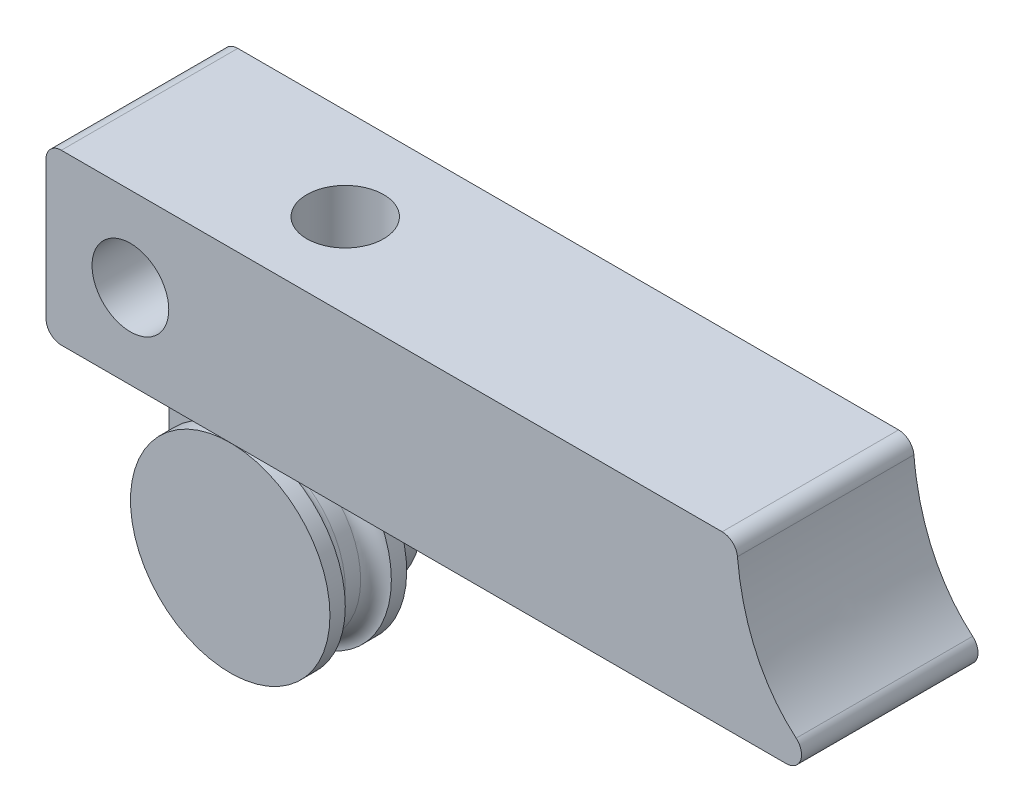
ISO-10303-21;
HEADER;
FILE_DESCRIPTION(('STEP AP214'),'2;1');
FILE_NAME('part.step','',(''),(''),'','','');
FILE_SCHEMA(('AUTOMOTIVE_DESIGN { 1 0 10303 214 1 1 1 1 }'));
ENDSEC;
DATA;
#1=APPLICATION_CONTEXT('core data for automotive mechanical design processes');
#2=APPLICATION_PROTOCOL_DEFINITION('international standard','automotive_design',2000,#1);
#3=PRODUCT_CONTEXT('',#1,'mechanical');
#4=PRODUCT('Part','Part','',(#3));
#5=PRODUCT_RELATED_PRODUCT_CATEGORY('part','',(#4));
#6=PRODUCT_DEFINITION_FORMATION('','',#4);
#7=PRODUCT_DEFINITION_CONTEXT('part definition',#1,'design');
#8=PRODUCT_DEFINITION('design','',#6,#7);
#9=PRODUCT_DEFINITION_SHAPE('','',#8);
#10=(LENGTH_UNIT() NAMED_UNIT(*) SI_UNIT(.MILLI.,.METRE.));
#11=(NAMED_UNIT(*) PLANE_ANGLE_UNIT() SI_UNIT($,.RADIAN.));
#12=(NAMED_UNIT(*) SI_UNIT($,.STERADIAN.) SOLID_ANGLE_UNIT());
#13=UNCERTAINTY_MEASURE_WITH_UNIT(LENGTH_MEASURE(1.E-05),#10,'distance_accuracy_value','');
#14=(GEOMETRIC_REPRESENTATION_CONTEXT(3) GLOBAL_UNCERTAINTY_ASSIGNED_CONTEXT((#13)) GLOBAL_UNIT_ASSIGNED_CONTEXT((#10,
#11,#12)) REPRESENTATION_CONTEXT('',''));
#15=CARTESIAN_POINT('',(0.,0.,0.));
#16=DIRECTION('',(0.,0.,1.));
#17=DIRECTION('',(1.,0.,0.));
#18=AXIS2_PLACEMENT_3D('',#15,#16,#17);
#19=CARTESIAN_POINT('',(9.00461664859584,-20.5,8.5));
#20=DIRECTION('',(0.,0.,-1.));
#21=DIRECTION('',(-1.,0.,0.));
#22=AXIS2_PLACEMENT_3D('',#19,#20,#21);
#23=CYLINDRICAL_SURFACE('',#22,6.5);
#24=CARTESIAN_POINT('',(9.00461664859584,-20.5,3.5));
#25=DIRECTION('',(0.,0.,1.));
#26=DIRECTION('',(1.,0.,0.));
#27=AXIS2_PLACEMENT_3D('',#24,#25,#26);
#28=CIRCLE('',#27,6.5);
#29=CARTESIAN_POINT('',(13.,-15.3729236522827,3.5));
#30=VERTEX_POINT('',#29);
#31=CARTESIAN_POINT('',(7.75230832429786,-26.8782226255356,3.5));
#32=VERTEX_POINT('',#31);
#33=EDGE_CURVE('E127',#30,#32,#28,.T.);
#34=ORIENTED_EDGE('',*,*,#33,.T.);
#35=EDGE_CURVE('E47',#32,#30,#28,.T.);
#36=ORIENTED_EDGE('',*,*,#35,.T.);
#37=EDGE_LOOP('',(#34,#36));
#38=FACE_BOUND('',#37,.T.);
#39=CARTESIAN_POINT('',(9.00461664859584,-20.5,4.5));
#40=DIRECTION('',(0.,0.,1.));
#41=DIRECTION('',(1.,0.,0.));
#42=AXIS2_PLACEMENT_3D('',#39,#40,#41);
#43=CIRCLE('',#42,6.5);
#44=CARTESIAN_POINT('',(15.5046166485958,-20.5,4.5));
#45=VERTEX_POINT('',#44);
#46=EDGE_CURVE('E128',#45,#45,#43,.T.);
#47=ORIENTED_EDGE('',*,*,#46,.F.);
#48=EDGE_LOOP('',(#47));
#49=FACE_BOUND('',#48,.T.);
#50=ADVANCED_FACE('F33',(#38,#49),#23,.T.);
#51=CARTESIAN_POINT('',(0.,0.,3.5));
#52=DIRECTION('',(1.,0.,0.));
#53=DIRECTION('',(0.,0.,-1.));
#54=AXIS2_PLACEMENT_3D('',#51,#52,#53);
#55=PLANE('',#54);
#56=DIRECTION('',(0.,-1.,0.));
#57=VECTOR('',#56,1.);
#58=CARTESIAN_POINT('',(0.,0.,11.5));
#59=LINE('',#58,#57);
#60=CARTESIAN_POINT('',(0.,-1.,11.5));
#61=VERTEX_POINT('',#60);
#62=CARTESIAN_POINT('',(0.,-10.,11.5));
#63=VERTEX_POINT('',#62);
#64=EDGE_CURVE('E262',#61,#63,#59,.T.);
#65=ORIENTED_EDGE('',*,*,#64,.F.);
#66=DIRECTION('',(0.,0.,-1.));
#67=VECTOR('',#66,1.);
#68=CARTESIAN_POINT('',(0.,-1.,3.5));
#69=LINE('',#68,#67);
#70=CARTESIAN_POINT('',(0.,-1.,0.));
#71=VERTEX_POINT('',#70);
#72=EDGE_CURVE('E294',#61,#71,#69,.T.);
#73=ORIENTED_EDGE('',*,*,#72,.T.);
#74=DIRECTION('',(0.,-1.,0.));
#75=VECTOR('',#74,1.);
#76=CARTESIAN_POINT('',(0.,0.,0.));
#77=LINE('',#76,#75);
#78=CARTESIAN_POINT('',(0.,-20.5,0.));
#79=VERTEX_POINT('',#78);
#80=EDGE_CURVE('E158',#71,#79,#77,.T.);
#81=ORIENTED_EDGE('',*,*,#80,.T.);
#82=DIRECTION('',(0.,0.,-1.));
#83=VECTOR('',#82,1.);
#84=CARTESIAN_POINT('',(0.,-20.5,3.5));
#85=LINE('',#84,#83);
#86=CARTESIAN_POINT('',(0.,-20.5,3.5));
#87=VERTEX_POINT('',#86);
#88=EDGE_CURVE('E562',#87,#79,#85,.T.);
#89=ORIENTED_EDGE('',*,*,#88,.F.);
#90=DIRECTION('',(0.,-1.,0.));
#91=VECTOR('',#90,1.);
#92=CARTESIAN_POINT('',(0.,0.,3.5));
#93=LINE('',#92,#91);
#94=CARTESIAN_POINT('',(0.,-10.,3.5));
#95=VERTEX_POINT('',#94);
#96=EDGE_CURVE('E55',#95,#87,#93,.T.);
#97=ORIENTED_EDGE('',*,*,#96,.F.);
#98=DIRECTION('',(0.,0.,-1.));
#99=VECTOR('',#98,1.);
#100=CARTESIAN_POINT('',(0.,-10.,3.5));
#101=LINE('',#100,#99);
#102=EDGE_CURVE('E292',#95,#63,#101,.F.);
#103=ORIENTED_EDGE('',*,*,#102,.T.);
#104=EDGE_LOOP('',(#65,#73,#81,#89,#97,#103));
#105=FACE_BOUND('',#104,.T.);
#106=ADVANCED_FACE('F202',(#105),#55,.F.);
#107=CARTESIAN_POINT('',(6.5,-20.5,3.5));
#108=DIRECTION('',(0.,0.,-1.));
#109=DIRECTION('',(-1.,0.,0.));
#110=AXIS2_PLACEMENT_3D('',#107,#108,#109);
#111=CYLINDRICAL_SURFACE('',#110,6.5);
#112=CARTESIAN_POINT('',(6.5,-20.5,0.));
#113=DIRECTION('',(0.,0.,1.));
#114=DIRECTION('',(1.,0.,0.));
#115=AXIS2_PLACEMENT_3D('',#112,#113,#114);
#116=CIRCLE('',#115,6.5);
#117=CARTESIAN_POINT('',(13.,-20.5,0.));
#118=VERTEX_POINT('',#117);
#119=EDGE_CURVE('E580',#79,#118,#116,.T.);
#120=ORIENTED_EDGE('',*,*,#119,.T.);
#121=DIRECTION('',(0.,0.,-1.));
#122=VECTOR('',#121,1.);
#123=CARTESIAN_POINT('',(13.,-20.5,3.5));
#124=LINE('',#123,#122);
#125=CARTESIAN_POINT('',(13.,-20.5,3.5));
#126=VERTEX_POINT('',#125);
#127=EDGE_CURVE('E141',#126,#118,#124,.T.);
#128=ORIENTED_EDGE('',*,*,#127,.F.);
#129=CARTESIAN_POINT('',(6.5,-20.5,3.5));
#130=DIRECTION('',(0.,0.,1.));
#131=DIRECTION('',(1.,0.,0.));
#132=AXIS2_PLACEMENT_3D('',#129,#130,#131);
#133=CIRCLE('',#132,6.5);
#134=EDGE_CURVE('E122',#32,#126,#133,.T.);
#135=ORIENTED_EDGE('',*,*,#134,.F.);
#136=CARTESIAN_POINT('',(6.5,-20.5,3.5));
#137=DIRECTION('',(0.,0.,1.));
#138=DIRECTION('',(1.,0.,0.));
#139=AXIS2_PLACEMENT_3D('',#136,#137,#138);
#140=CIRCLE('',#139,6.5);
#141=EDGE_CURVE('E139',#87,#32,#140,.T.);
#142=ORIENTED_EDGE('',*,*,#141,.F.);
#143=ORIENTED_EDGE('',*,*,#88,.T.);
#144=EDGE_LOOP('',(#120,#128,#135,#142,#143));
#145=FACE_BOUND('',#144,.T.);
#146=ADVANCED_FACE('F137',(#145),#111,.T.);
#147=CARTESIAN_POINT('',(13.,-11.,3.5));
#148=DIRECTION('',(-1.,0.,0.));
#149=DIRECTION('',(0.,-1.,0.));
#150=AXIS2_PLACEMENT_3D('',#147,#148,#149);
#151=PLANE('',#150);
#152=DIRECTION('',(0.,1.,0.));
#153=VECTOR('',#152,1.);
#154=CARTESIAN_POINT('',(13.,-11.,0.));
#155=LINE('',#154,#153);
#156=CARTESIAN_POINT('',(13.,-11.,0.));
#157=VERTEX_POINT('',#156);
#158=EDGE_CURVE('E579',#118,#157,#155,.T.);
#159=ORIENTED_EDGE('',*,*,#158,.T.);
#160=DIRECTION('',(0.,0.,-1.));
#161=VECTOR('',#160,1.);
#162=CARTESIAN_POINT('',(13.,-11.,3.5));
#163=LINE('',#162,#161);
#164=CARTESIAN_POINT('',(13.,-11.,3.5));
#165=VERTEX_POINT('',#164);
#166=EDGE_CURVE('E153',#165,#157,#163,.T.);
#167=ORIENTED_EDGE('',*,*,#166,.F.);
#168=DIRECTION('',(0.,1.,0.));
#169=VECTOR('',#168,1.);
#170=CARTESIAN_POINT('',(13.,-11.,3.5));
#171=LINE('',#170,#169);
#172=EDGE_CURVE('E146',#30,#165,#171,.T.);
#173=ORIENTED_EDGE('',*,*,#172,.F.);
#174=EDGE_CURVE('E125',#126,#30,#171,.T.);
#175=ORIENTED_EDGE('',*,*,#174,.F.);
#176=ORIENTED_EDGE('',*,*,#127,.T.);
#177=EDGE_LOOP('',(#159,#167,#173,#175,#176));
#178=FACE_BOUND('',#177,.T.);
#179=ADVANCED_FACE('F370',(#178),#151,.F.);
#180=CARTESIAN_POINT('',(52.,-11.,3.5));
#181=DIRECTION('',(0.,1.,0.));
#182=DIRECTION('',(-1.,0.,0.));
#183=AXIS2_PLACEMENT_3D('',#180,#181,#182);
#184=PLANE('',#183);
#185=CARTESIAN_POINT('',(14.,-11.,6.));
#186=DIRECTION('',(0.,1.,0.));
#187=DIRECTION('',(-1.,0.,0.));
#188=AXIS2_PLACEMENT_3D('',#185,#186,#187);
#189=CIRCLE('',#188,1.5);
#190=CARTESIAN_POINT('',(12.5,-11.,6.));
#191=VERTEX_POINT('',#190);
#192=EDGE_CURVE('E237',#191,#191,#189,.F.);
#193=ORIENTED_EDGE('',*,*,#192,.F.);
#194=EDGE_LOOP('',(#193));
#195=FACE_BOUND('',#194,.T.);
#196=DIRECTION('',(1.,0.,0.));
#197=VECTOR('',#196,1.);
#198=CARTESIAN_POINT('',(52.,-11.,0.));
#199=LINE('',#198,#197);
#200=CARTESIAN_POINT('',(48.2344124214659,-11.,0.));
#201=VERTEX_POINT('',#200);
#202=EDGE_CURVE('E573',#157,#201,#199,.T.);
#203=ORIENTED_EDGE('',*,*,#202,.T.);
#204=DIRECTION('',(0.,0.,-1.));
#205=VECTOR('',#204,1.);
#206=CARTESIAN_POINT('',(48.2344124214659,-11.,3.5));
#207=LINE('',#206,#205);
#208=CARTESIAN_POINT('',(48.2344124214659,-11.,11.5));
#209=VERTEX_POINT('',#208);
#210=EDGE_CURVE('E278',#201,#209,#207,.F.);
#211=ORIENTED_EDGE('',*,*,#210,.T.);
#212=DIRECTION('',(1.,0.,0.));
#213=VECTOR('',#212,1.);
#214=CARTESIAN_POINT('',(13.,-11.,11.5));
#215=LINE('',#214,#213);
#216=CARTESIAN_POINT('',(1.,-11.,11.5));
#217=VERTEX_POINT('',#216);
#218=EDGE_CURVE('E181',#217,#209,#215,.T.);
#219=ORIENTED_EDGE('',*,*,#218,.F.);
#220=DIRECTION('',(0.,0.,-1.));
#221=VECTOR('',#220,1.);
#222=CARTESIAN_POINT('',(1.,-11.,3.5));
#223=LINE('',#222,#221);
#224=CARTESIAN_POINT('',(1.,-11.,3.5));
#225=VERTEX_POINT('',#224);
#226=EDGE_CURVE('E553',#217,#225,#223,.T.);
#227=ORIENTED_EDGE('',*,*,#226,.T.);
#228=DIRECTION('',(1.,0.,0.));
#229=VECTOR('',#228,1.);
#230=CARTESIAN_POINT('',(13.,-11.,3.5));
#231=LINE('',#230,#229);
#232=EDGE_CURVE('E182',#225,#165,#231,.T.);
#233=ORIENTED_EDGE('',*,*,#232,.T.);
#234=ORIENTED_EDGE('',*,*,#166,.T.);
#235=EDGE_LOOP('',(#203,#211,#219,#227,#233,#234));
#236=FACE_BOUND('',#235,.T.);
#237=ADVANCED_FACE('F170',(#195,#236),#184,.F.);
#238=CARTESIAN_POINT('',(52.,-11.,3.5));
#239=CARTESIAN_POINT('',(46.8949464905757,-9.23286856343982,3.5));
#240=CARTESIAN_POINT('',(45.1675948279144,-4.34290235470996,3.5));
#241=CARTESIAN_POINT('',(45.,0.,3.5));
#242=B_SPLINE_CURVE_WITH_KNOTS('',3,(#238,#239,#240,#241),.UNSPECIFIED.,.F.,.F.,(4,4),(0.,1.),.UNSPECIFIED.);
#243=DIRECTION('',(0.,0.,-1.));
#244=VECTOR('',#243,1.);
#245=SURFACE_OF_LINEAR_EXTRUSION('',#242,#244);
#246=CARTESIAN_POINT('',(52.,-11.,11.5));
#247=CARTESIAN_POINT('',(51.8296051218426,-10.9410305615004,11.5));
#248=CARTESIAN_POINT('',(51.6606758779547,-10.8777610347871,11.5));
#249=CARTESIAN_POINT('',(51.3262442781638,-10.7424235577593,11.5));
#250=CARTESIAN_POINT('',(51.1607444213125,-10.670349438062,11.5));
#251=CARTESIAN_POINT('',(50.8338823900643,-10.5172746983141,11.5));
#252=CARTESIAN_POINT('',(50.6725208969708,-10.4362726199259,11.5));
#253=CARTESIAN_POINT('',(50.3551160296518,-10.2656024507293,11.5));
#254=CARTESIAN_POINT('',(50.1990571368458,-10.1759632489498,11.5));
#255=CARTESIAN_POINT('',(49.8923684678874,-9.98790175000235,11.5));
#256=CARTESIAN_POINT('',(49.7417374609911,-9.88948146171598,11.5));
#257=CARTESIAN_POINT('',(49.446473089988,-9.68404983402533,11.5));
#258=CARTESIAN_POINT('',(49.3018391025184,-9.57703939094041,11.5));
#259=CARTESIAN_POINT('',(49.0185491332929,-9.35430745628288,11.5));
#260=CARTESIAN_POINT('',(48.8799179743163,-9.2385543880469,11.5));
#261=CARTESIAN_POINT('',(48.609667218869,-8.99910105370671,11.5));
#262=CARTESIAN_POINT('',(48.4780485563382,-8.87539973385233,11.5));
#263=CARTESIAN_POINT('',(48.2222173454264,-8.62057432703871,11.5));
#264=CARTESIAN_POINT('',(48.0980045476517,-8.48945049032417,11.5));
#265=CARTESIAN_POINT('',(47.8573158265179,-8.2204225506348,11.5));
#266=CARTESIAN_POINT('',(47.7408356508579,-8.08252224799497,11.5));
#267=CARTESIAN_POINT('',(47.5156981207765,-7.80047706702407,11.5));
#268=CARTESIAN_POINT('',(47.4070408598238,-7.65633211411437,11.5));
#269=CARTESIAN_POINT('',(47.1976168173085,-7.36242901584609,11.5));
#270=CARTESIAN_POINT('',(47.0968505458496,-7.21267050852967,11.5));
#271=CARTESIAN_POINT('',(46.819966868029,-6.77727064328946,11.5));
#272=CARTESIAN_POINT('',(46.6534952164884,-6.48543329774246,11.5));
#273=CARTESIAN_POINT('',(46.347037199272,-5.88820886008269,11.5));
#274=CARTESIAN_POINT('',(46.2070587111861,-5.58281777106023,11.5));
#275=CARTESIAN_POINT('',(45.9517532682585,-4.96049866623428,11.5));
#276=CARTESIAN_POINT('',(45.8365292698003,-4.64352864660464,11.5));
#277=CARTESIAN_POINT('',(45.6299042534282,-4.0020155056135,11.5));
#278=CARTESIAN_POINT('',(45.5385002393067,-3.67747334231832,11.5));
#279=CARTESIAN_POINT('',(45.3905880854971,-3.07465101902599,11.5));
#280=CARTESIAN_POINT('',(45.3308493613713,-2.79715257200451,11.5));
#281=CARTESIAN_POINT('',(45.2262612516813,-2.23937560175497,11.5));
#282=CARTESIAN_POINT('',(45.1814117061586,-1.95909710842702,11.5));
#283=CARTESIAN_POINT('',(45.1062257754105,-1.39956061411577,11.5));
#284=CARTESIAN_POINT('',(45.0757445612143,-1.12032187232862,11.5));
#285=CARTESIAN_POINT('',(45.0280612521039,-0.560793887329184,11.5));
#286=CARTESIAN_POINT('',(45.0108551055326,-0.280504990897567,11.5));
#287=CARTESIAN_POINT('',(45.,0.,11.5));
#288=B_SPLINE_CURVE_WITH_KNOTS('',3,(#246,#247,#248,#249,#250,#251,#252,#253,#254,#255,#256,
#257,#258,#259,#260,#261,#262,#263,#264,#265,#266,#267,#268,#269,#270,#271,#272,#273,#274,#275,
#276,#277,#278,#279,#280,#281,#282,#283,#284,#285,#286,#287),.UNSPECIFIED.,.F.,.F.,(4,2,2,2,2,2,
2,2,2,2,2,2,2,2,2,2,2,2,2,2,4),(0.,0.540905634477601,1.08219247953344,1.62356787250748,
2.1631915170581,2.70269202491993,3.24213631286764,3.78363184907054,4.32519932349458,
4.86674855023163,5.40799745971856,5.94925283501767,6.49054317030083,7.49690631779327,
8.50356823308385,9.51433920188925,10.5249829689678,11.3761384295554,12.2272847456546,
13.069657896711,13.9117738469042),.UNSPECIFIED.);
#289=CARTESIAN_POINT('',(48.8826433313742,-9.23855618234865,11.5));
#290=VERTEX_POINT('',#289);
#291=CARTESIAN_POINT('',(45.0580568694072,-0.911082075159101,11.5));
#292=VERTEX_POINT('',#291);
#293=EDGE_CURVE('E174',#290,#292,#288,.T.);
#294=ORIENTED_EDGE('',*,*,#293,.F.);
#295=DIRECTION('',(0.,0.,-1.));
#296=VECTOR('',#295,1.);
#297=CARTESIAN_POINT('',(48.8826433313742,-9.23855618234865,11.5));
#298=LINE('',#297,#296);
#299=CARTESIAN_POINT('',(48.8826433313742,-9.23855618234867,0.));
#300=VERTEX_POINT('',#299);
#301=EDGE_CURVE('E280',#290,#300,#298,.T.);
#302=ORIENTED_EDGE('',*,*,#301,.T.);
#303=CARTESIAN_POINT('',(52.,-11.,0.));
#304=CARTESIAN_POINT('',(46.8949464905757,-9.23286856343982,0.));
#305=CARTESIAN_POINT('',(45.1675948279144,-4.34290235470996,0.));
#306=CARTESIAN_POINT('',(45.,0.,0.));
#307=B_SPLINE_CURVE_WITH_KNOTS('',3,(#303,#304,#305,#306),.UNSPECIFIED.,.F.,.F.,(4,4),(0.,1.),.UNSPECIFIED.);
#308=CARTESIAN_POINT('',(45.0580568694078,-0.911082075165415,0.));
#309=VERTEX_POINT('',#308);
#310=EDGE_CURVE('E568',#300,#309,#307,.T.);
#311=ORIENTED_EDGE('',*,*,#310,.T.);
#312=DIRECTION('',(0.,0.,-1.));
#313=VECTOR('',#312,1.);
#314=CARTESIAN_POINT('',(45.0580568694072,-0.911082075159099,0.));
#315=LINE('',#314,#313);
#316=EDGE_CURVE('E540',#309,#292,#315,.F.);
#317=ORIENTED_EDGE('',*,*,#316,.T.);
#318=EDGE_LOOP('',(#294,#302,#311,#317));
#319=FACE_BOUND('',#318,.T.);
#320=ADVANCED_FACE('F164',(#319),#245,.F.);
#321=CARTESIAN_POINT('',(0.,0.,3.5));
#322=DIRECTION('',(0.,-1.,0.));
#323=DIRECTION('',(0.,0.,-1.));
#324=AXIS2_PLACEMENT_3D('',#321,#322,#323);
#325=PLANE('',#324);
#326=CARTESIAN_POINT('',(14.,0.,6.));
#327=DIRECTION('',(0.,1.,0.));
#328=DIRECTION('',(0.,0.,1.));
#329=AXIS2_PLACEMENT_3D('',#326,#327,#328);
#330=CIRCLE('',#329,2.5);
#331=CARTESIAN_POINT('',(14.,0.,8.5));
#332=VERTEX_POINT('',#331);
#333=EDGE_CURVE('E240',#332,#332,#330,.T.);
#334=ORIENTED_EDGE('',*,*,#333,.F.);
#335=EDGE_LOOP('',(#334));
#336=FACE_BOUND('',#335,.T.);
#337=DIRECTION('',(-1.,0.,0.));
#338=VECTOR('',#337,1.);
#339=CARTESIAN_POINT('',(45.,0.,11.5));
#340=LINE('',#339,#338);
#341=CARTESIAN_POINT('',(44.0620179130195,0.,11.5));
#342=VERTEX_POINT('',#341);
#343=CARTESIAN_POINT('',(1.00000000000001,0.,11.5));
#344=VERTEX_POINT('',#343);
#345=EDGE_CURVE('E259',#342,#344,#340,.T.);
#346=ORIENTED_EDGE('',*,*,#345,.F.);
#347=DIRECTION('',(0.,0.,-1.));
#348=VECTOR('',#347,1.);
#349=CARTESIAN_POINT('',(44.0620179130195,0.,3.5));
#350=LINE('',#349,#348);
#351=CARTESIAN_POINT('',(44.0620179130195,0.,0.));
#352=VERTEX_POINT('',#351);
#353=EDGE_CURVE('E284',#342,#352,#350,.T.);
#354=ORIENTED_EDGE('',*,*,#353,.T.);
#355=DIRECTION('',(-1.,0.,0.));
#356=VECTOR('',#355,1.);
#357=CARTESIAN_POINT('',(0.,0.,0.));
#358=LINE('',#357,#356);
#359=CARTESIAN_POINT('',(1.,0.,0.));
#360=VERTEX_POINT('',#359);
#361=EDGE_CURVE('E149',#352,#360,#358,.T.);
#362=ORIENTED_EDGE('',*,*,#361,.T.);
#363=DIRECTION('',(0.,0.,-1.));
#364=VECTOR('',#363,1.);
#365=CARTESIAN_POINT('',(1.,0.,3.5));
#366=LINE('',#365,#364);
#367=EDGE_CURVE('E281',#360,#344,#366,.F.);
#368=ORIENTED_EDGE('',*,*,#367,.T.);
#369=EDGE_LOOP('',(#346,#354,#362,#368));
#370=FACE_BOUND('',#369,.T.);
#371=ADVANCED_FACE('F169',(#336,#370),#325,.F.);
#372=CARTESIAN_POINT('',(6.5,-20.5,3.5));
#373=DIRECTION('',(0.,0.,1.));
#374=DIRECTION('',(1.,0.,0.));
#375=AXIS2_PLACEMENT_3D('',#372,#373,#374);
#376=PLANE('',#375);
#377=ORIENTED_EDGE('',*,*,#141,.T.);
#378=ORIENTED_EDGE('',*,*,#33,.F.);
#379=ORIENTED_EDGE('',*,*,#172,.T.);
#380=ORIENTED_EDGE('',*,*,#232,.F.);
#381=CARTESIAN_POINT('',(1.,-10.,3.5));
#382=DIRECTION('',(0.,0.,1.));
#383=DIRECTION('',(1.,0.,0.));
#384=AXIS2_PLACEMENT_3D('',#381,#382,#383);
#385=CIRCLE('',#384,1.);
#386=EDGE_CURVE('E297',#225,#95,#385,.F.);
#387=ORIENTED_EDGE('',*,*,#386,.T.);
#388=ORIENTED_EDGE('',*,*,#96,.T.);
#389=EDGE_LOOP('',(#377,#378,#379,#380,#387,#388));
#390=FACE_BOUND('',#389,.T.);
#391=ADVANCED_FACE('F145',(#390),#376,.T.);
#392=CARTESIAN_POINT('',(6.5,-20.5,0.));
#393=DIRECTION('',(0.,0.,1.));
#394=DIRECTION('',(1.,0.,0.));
#395=AXIS2_PLACEMENT_3D('',#392,#393,#394);
#396=PLANE('',#395);
#397=CARTESIAN_POINT('',(5.5,-5.5,0.));
#398=DIRECTION('',(0.,0.,1.));
#399=DIRECTION('',(1.,0.,0.));
#400=AXIS2_PLACEMENT_3D('',#397,#398,#399);
#401=CIRCLE('',#400,1.5);
#402=CARTESIAN_POINT('',(7.,-5.5,0.));
#403=VERTEX_POINT('',#402);
#404=EDGE_CURVE('E249',#403,#403,#401,.F.);
#405=ORIENTED_EDGE('',*,*,#404,.F.);
#406=EDGE_LOOP('',(#405));
#407=FACE_BOUND('',#406,.T.);
#408=CARTESIAN_POINT('',(9.00461664859584,-20.5,0.));
#409=DIRECTION('',(0.,0.,1.));
#410=DIRECTION('',(1.,0.,0.));
#411=AXIS2_PLACEMENT_3D('',#408,#409,#410);
#412=CIRCLE('',#411,1.5);
#413=CARTESIAN_POINT('',(10.5046166485958,-20.5,0.));
#414=VERTEX_POINT('',#413);
#415=EDGE_CURVE('E256',#414,#414,#412,.T.);
#416=ORIENTED_EDGE('',*,*,#415,.T.);
#417=EDGE_LOOP('',(#416));
#418=FACE_BOUND('',#417,.T.);
#419=ORIENTED_EDGE('',*,*,#310,.F.);
#420=CARTESIAN_POINT('',(48.2344124214659,-9.99999999999998,0.));
#421=DIRECTION('',(0.,0.,1.));
#422=DIRECTION('',(1.,0.,0.));
#423=AXIS2_PLACEMENT_3D('',#420,#421,#422);
#424=CIRCLE('',#423,1.);
#425=EDGE_CURVE('E555',#300,#201,#424,.F.);
#426=ORIENTED_EDGE('',*,*,#425,.T.);
#427=ORIENTED_EDGE('',*,*,#202,.F.);
#428=ORIENTED_EDGE('',*,*,#158,.F.);
#429=ORIENTED_EDGE('',*,*,#119,.F.);
#430=ORIENTED_EDGE('',*,*,#80,.F.);
#431=CARTESIAN_POINT('',(1.,-1.,0.));
#432=DIRECTION('',(0.,0.,1.));
#433=DIRECTION('',(1.,0.,0.));
#434=AXIS2_PLACEMENT_3D('',#431,#432,#433);
#435=CIRCLE('',#434,1.);
#436=EDGE_CURVE('E548',#71,#360,#435,.F.);
#437=ORIENTED_EDGE('',*,*,#436,.T.);
#438=ORIENTED_EDGE('',*,*,#361,.F.);
#439=CARTESIAN_POINT('',(44.0620179130195,-0.999999999999996,0.));
#440=DIRECTION('',(0.,0.,1.));
#441=DIRECTION('',(1.,0.,0.));
#442=AXIS2_PLACEMENT_3D('',#439,#440,#441);
#443=CIRCLE('',#442,1.);
#444=EDGE_CURVE('E557',#352,#309,#443,.F.);
#445=ORIENTED_EDGE('',*,*,#444,.T.);
#446=EDGE_LOOP('',(#419,#426,#427,#428,#429,#430,#437,#438,#445));
#447=FACE_BOUND('',#446,.T.);
#448=ADVANCED_FACE('F190',(#407,#418,#447),#396,.F.);
#449=CARTESIAN_POINT('',(46.6484529944338,-6.46591409430617,11.5));
#450=DIRECTION('',(0.,0.,1.));
#451=DIRECTION('',(1.,0.,0.));
#452=AXIS2_PLACEMENT_3D('',#449,#450,#451);
#453=PLANE('',#452);
#454=CARTESIAN_POINT('',(5.5,-5.5,11.5));
#455=DIRECTION('',(0.,0.,1.));
#456=DIRECTION('',(1.,0.,0.));
#457=AXIS2_PLACEMENT_3D('',#454,#455,#456);
#458=CIRCLE('',#457,2.5);
#459=CARTESIAN_POINT('',(8.,-5.5,11.5));
#460=VERTEX_POINT('',#459);
#461=EDGE_CURVE('E252',#460,#460,#458,.T.);
#462=ORIENTED_EDGE('',*,*,#461,.F.);
#463=EDGE_LOOP('',(#462));
#464=FACE_BOUND('',#463,.T.);
#465=ORIENTED_EDGE('',*,*,#218,.T.);
#466=CARTESIAN_POINT('',(48.2344124214659,-9.99999999999998,11.5));
#467=DIRECTION('',(0.,0.,1.));
#468=DIRECTION('',(1.,0.,0.));
#469=AXIS2_PLACEMENT_3D('',#466,#467,#468);
#470=CIRCLE('',#469,1.);
#471=EDGE_CURVE('E268',#209,#290,#470,.T.);
#472=ORIENTED_EDGE('',*,*,#471,.T.);
#473=ORIENTED_EDGE('',*,*,#293,.T.);
#474=CARTESIAN_POINT('',(44.0620179130195,-0.999999999999996,11.5));
#475=DIRECTION('',(0.,0.,1.));
#476=DIRECTION('',(1.,0.,0.));
#477=AXIS2_PLACEMENT_3D('',#474,#475,#476);
#478=CIRCLE('',#477,1.);
#479=EDGE_CURVE('E282',#292,#342,#478,.T.);
#480=ORIENTED_EDGE('',*,*,#479,.T.);
#481=ORIENTED_EDGE('',*,*,#345,.T.);
#482=CARTESIAN_POINT('',(1.,-1.,11.5));
#483=DIRECTION('',(0.,0.,1.));
#484=DIRECTION('',(1.,0.,0.));
#485=AXIS2_PLACEMENT_3D('',#482,#483,#484);
#486=CIRCLE('',#485,1.);
#487=EDGE_CURVE('E286',#344,#61,#486,.T.);
#488=ORIENTED_EDGE('',*,*,#487,.T.);
#489=ORIENTED_EDGE('',*,*,#64,.T.);
#490=CARTESIAN_POINT('',(1.,-10.,11.5));
#491=DIRECTION('',(0.,0.,1.));
#492=DIRECTION('',(1.,0.,0.));
#493=AXIS2_PLACEMENT_3D('',#490,#491,#492);
#494=CIRCLE('',#493,1.);
#495=EDGE_CURVE('E271',#63,#217,#494,.T.);
#496=ORIENTED_EDGE('',*,*,#495,.T.);
#497=EDGE_LOOP('',(#465,#472,#473,#480,#481,#488,#489,#496));
#498=FACE_BOUND('',#497,.T.);
#499=ADVANCED_FACE('F184',(#464,#498),#453,.T.);
#500=CARTESIAN_POINT('',(48.2344124214659,-9.99999999999998,5.75));
#501=DIRECTION('',(0.,0.,-1.));
#502=DIRECTION('',(-1.,0.,0.));
#503=AXIS2_PLACEMENT_3D('',#500,#501,#502);
#504=CYLINDRICAL_SURFACE('',#503,1.);
#505=ORIENTED_EDGE('',*,*,#471,.F.);
#506=ORIENTED_EDGE('',*,*,#210,.F.);
#507=ORIENTED_EDGE('',*,*,#425,.F.);
#508=ORIENTED_EDGE('',*,*,#301,.F.);
#509=EDGE_LOOP('',(#505,#506,#507,#508));
#510=FACE_BOUND('',#509,.T.);
#511=ADVANCED_FACE('F189',(#510),#504,.T.);
#512=CARTESIAN_POINT('',(44.0620179130195,-0.999999999999996,5.75));
#513=DIRECTION('',(0.,0.,-1.));
#514=DIRECTION('',(-1.,0.,0.));
#515=AXIS2_PLACEMENT_3D('',#512,#513,#514);
#516=CYLINDRICAL_SURFACE('',#515,1.);
#517=ORIENTED_EDGE('',*,*,#479,.F.);
#518=ORIENTED_EDGE('',*,*,#316,.F.);
#519=ORIENTED_EDGE('',*,*,#444,.F.);
#520=ORIENTED_EDGE('',*,*,#353,.F.);
#521=EDGE_LOOP('',(#517,#518,#519,#520));
#522=FACE_BOUND('',#521,.T.);
#523=ADVANCED_FACE('F496',(#522),#516,.T.);
#524=CARTESIAN_POINT('',(1.,-1.,3.5));
#525=DIRECTION('',(0.,0.,-1.));
#526=DIRECTION('',(-1.,0.,0.));
#527=AXIS2_PLACEMENT_3D('',#524,#525,#526);
#528=CYLINDRICAL_SURFACE('',#527,1.);
#529=ORIENTED_EDGE('',*,*,#487,.F.);
#530=ORIENTED_EDGE('',*,*,#367,.F.);
#531=ORIENTED_EDGE('',*,*,#436,.F.);
#532=ORIENTED_EDGE('',*,*,#72,.F.);
#533=EDGE_LOOP('',(#529,#530,#531,#532));
#534=FACE_BOUND('',#533,.T.);
#535=ADVANCED_FACE('F486',(#534),#528,.T.);
#536=CARTESIAN_POINT('',(1.,-10.,3.5));
#537=DIRECTION('',(0.,0.,-1.));
#538=DIRECTION('',(-1.,0.,0.));
#539=AXIS2_PLACEMENT_3D('',#536,#537,#538);
#540=CYLINDRICAL_SURFACE('',#539,1.);
#541=ORIENTED_EDGE('',*,*,#495,.F.);
#542=ORIENTED_EDGE('',*,*,#102,.F.);
#543=ORIENTED_EDGE('',*,*,#386,.F.);
#544=ORIENTED_EDGE('',*,*,#226,.F.);
#545=EDGE_LOOP('',(#541,#542,#543,#544));
#546=FACE_BOUND('',#545,.T.);
#547=ADVANCED_FACE('F477',(#546),#540,.T.);
#548=CARTESIAN_POINT('',(9.00461664859584,-20.5,-4.5));
#549=DIRECTION('',(0.,0.,1.));
#550=DIRECTION('',(1.,0.,0.));
#551=AXIS2_PLACEMENT_3D('',#548,#549,#550);
#552=CYLINDRICAL_SURFACE('',#551,1.5);
#553=CARTESIAN_POINT('',(9.00461664859584,-20.5,3.5));
#554=DIRECTION('',(0.,0.,1.));
#555=DIRECTION('',(1.,0.,0.));
#556=AXIS2_PLACEMENT_3D('',#553,#554,#555);
#557=CIRCLE('',#556,1.5);
#558=CARTESIAN_POINT('',(10.5046166485958,-20.5,3.5));
#559=VERTEX_POINT('',#558);
#560=EDGE_CURVE('E143',#559,#559,#557,.F.);
#561=ORIENTED_EDGE('',*,*,#560,.F.);
#562=EDGE_LOOP('',(#561));
#563=FACE_BOUND('',#562,.T.);
#564=ORIENTED_EDGE('',*,*,#415,.F.);
#565=EDGE_LOOP('',(#564));
#566=FACE_BOUND('',#565,.T.);
#567=ADVANCED_FACE('F192',(#563,#566),#552,.F.);
#568=CARTESIAN_POINT('',(5.5,-5.5,6.5));
#569=DIRECTION('',(0.,0.,1.));
#570=DIRECTION('',(1.,0.,0.));
#571=AXIS2_PLACEMENT_3D('',#568,#569,#570);
#572=CYLINDRICAL_SURFACE('',#571,2.5);
#573=CARTESIAN_POINT('',(5.5,-5.5,6.5));
#574=DIRECTION('',(0.,0.,1.));
#575=DIRECTION('',(1.,0.,0.));
#576=AXIS2_PLACEMENT_3D('',#573,#574,#575);
#577=CIRCLE('',#576,2.5);
#578=CARTESIAN_POINT('',(8.,-5.5,6.5));
#579=VERTEX_POINT('',#578);
#580=EDGE_CURVE('E253',#579,#579,#577,.T.);
#581=ORIENTED_EDGE('',*,*,#580,.F.);
#582=EDGE_LOOP('',(#581));
#583=FACE_BOUND('',#582,.T.);
#584=ORIENTED_EDGE('',*,*,#461,.T.);
#585=EDGE_LOOP('',(#584));
#586=FACE_BOUND('',#585,.T.);
#587=ADVANCED_FACE('F447',(#583,#586),#572,.F.);
#588=CARTESIAN_POINT('',(5.5,-5.5,6.5));
#589=DIRECTION('',(0.,0.,1.));
#590=DIRECTION('',(1.,0.,0.));
#591=AXIS2_PLACEMENT_3D('',#588,#589,#590);
#592=PLANE('',#591);
#593=CARTESIAN_POINT('',(5.5,-5.5,6.5));
#594=DIRECTION('',(0.,0.,1.));
#595=DIRECTION('',(1.,0.,0.));
#596=AXIS2_PLACEMENT_3D('',#593,#594,#595);
#597=CIRCLE('',#596,1.5);
#598=CARTESIAN_POINT('',(7.,-5.5,6.5));
#599=VERTEX_POINT('',#598);
#600=EDGE_CURVE('E244',#599,#599,#597,.T.);
#601=ORIENTED_EDGE('',*,*,#600,.F.);
#602=EDGE_LOOP('',(#601));
#603=FACE_BOUND('',#602,.T.);
#604=ORIENTED_EDGE('',*,*,#580,.T.);
#605=EDGE_LOOP('',(#604));
#606=FACE_BOUND('',#605,.T.);
#607=ADVANCED_FACE('F438',(#603,#606),#592,.T.);
#608=CARTESIAN_POINT('',(5.5,-5.5,-0.00100000000000013));
#609=DIRECTION('',(0.,0.,1.));
#610=DIRECTION('',(1.,0.,0.));
#611=AXIS2_PLACEMENT_3D('',#608,#609,#610);
#612=CYLINDRICAL_SURFACE('',#611,1.5);
#613=CARTESIAN_POINT('',(7.,-5.5,6.5));
#614=CARTESIAN_POINT('',(7.,-5.5,6.43229166666667));
#615=CARTESIAN_POINT('',(7.,-5.5,6.36458333333333));
#616=CARTESIAN_POINT('',(7.,-5.5,6.22916666666667));
#617=CARTESIAN_POINT('',(7.,-5.5,6.16145833333333));
#618=CARTESIAN_POINT('',(7.,-5.5,6.02604166666667));
#619=CARTESIAN_POINT('',(7.,-5.5,5.95833333333333));
#620=CARTESIAN_POINT('',(7.,-5.5,5.82291666666667));
#621=CARTESIAN_POINT('',(7.,-5.5,5.75520833333333));
#622=CARTESIAN_POINT('',(7.,-5.5,5.61979166666667));
#623=CARTESIAN_POINT('',(7.,-5.5,5.55208333333333));
#624=CARTESIAN_POINT('',(7.,-5.5,5.41666666666667));
#625=CARTESIAN_POINT('',(7.,-5.5,5.34895833333333));
#626=CARTESIAN_POINT('',(7.,-5.5,5.21354166666667));
#627=CARTESIAN_POINT('',(7.,-5.5,5.14583333333333));
#628=CARTESIAN_POINT('',(7.,-5.5,5.01041666666667));
#629=CARTESIAN_POINT('',(7.,-5.5,4.94270833333333));
#630=CARTESIAN_POINT('',(7.,-5.5,4.80729166666667));
#631=CARTESIAN_POINT('',(7.,-5.5,4.73958333333333));
#632=CARTESIAN_POINT('',(7.,-5.5,4.60416666666667));
#633=CARTESIAN_POINT('',(7.,-5.5,4.53645833333333));
#634=CARTESIAN_POINT('',(7.,-5.5,4.40104166666667));
#635=CARTESIAN_POINT('',(7.,-5.5,4.33333333333333));
#636=CARTESIAN_POINT('',(7.,-5.5,4.19791666666667));
#637=CARTESIAN_POINT('',(7.,-5.5,4.13020833333333));
#638=CARTESIAN_POINT('',(7.,-5.5,3.99479166666667));
#639=CARTESIAN_POINT('',(7.,-5.5,3.92708333333333));
#640=CARTESIAN_POINT('',(7.,-5.5,3.79166666666667));
#641=CARTESIAN_POINT('',(7.,-5.5,3.72395833333333));
#642=CARTESIAN_POINT('',(7.,-5.5,3.58854166666667));
#643=CARTESIAN_POINT('',(7.,-5.5,3.52083333333333));
#644=CARTESIAN_POINT('',(7.,-5.5,3.38541666666667));
#645=CARTESIAN_POINT('',(7.,-5.5,3.31770833333333));
#646=CARTESIAN_POINT('',(7.,-5.5,3.18229166666667));
#647=CARTESIAN_POINT('',(7.,-5.5,3.11458333333333));
#648=CARTESIAN_POINT('',(7.,-5.5,2.97916666666667));
#649=CARTESIAN_POINT('',(7.,-5.5,2.91145833333333));
#650=CARTESIAN_POINT('',(7.,-5.5,2.77604166666667));
#651=CARTESIAN_POINT('',(7.,-5.5,2.70833333333333));
#652=CARTESIAN_POINT('',(7.,-5.5,2.57291666666667));
#653=CARTESIAN_POINT('',(7.,-5.5,2.50520833333333));
#654=CARTESIAN_POINT('',(7.,-5.5,2.36979166666667));
#655=CARTESIAN_POINT('',(7.,-5.5,2.30208333333333));
#656=CARTESIAN_POINT('',(7.,-5.5,2.16666666666667));
#657=CARTESIAN_POINT('',(7.,-5.5,2.09895833333333));
#658=CARTESIAN_POINT('',(7.,-5.5,1.96354166666667));
#659=CARTESIAN_POINT('',(7.,-5.5,1.89583333333333));
#660=CARTESIAN_POINT('',(7.,-5.5,1.76041666666667));
#661=CARTESIAN_POINT('',(7.,-5.5,1.69270833333333));
#662=CARTESIAN_POINT('',(7.,-5.5,1.55729166666667));
#663=CARTESIAN_POINT('',(7.,-5.5,1.48958333333333));
#664=CARTESIAN_POINT('',(7.,-5.5,1.35416666666667));
#665=CARTESIAN_POINT('',(7.,-5.5,1.28645833333333));
#666=CARTESIAN_POINT('',(7.,-5.5,1.15104166666667));
#667=CARTESIAN_POINT('',(7.,-5.5,1.08333333333333));
#668=CARTESIAN_POINT('',(7.,-5.5,0.947916666666666));
#669=CARTESIAN_POINT('',(7.,-5.5,0.880208333333333));
#670=CARTESIAN_POINT('',(7.,-5.5,0.744791666666666));
#671=CARTESIAN_POINT('',(7.,-5.5,0.677083333333333));
#672=CARTESIAN_POINT('',(7.,-5.5,0.541666666666667));
#673=CARTESIAN_POINT('',(7.,-5.5,0.473958333333333));
#674=CARTESIAN_POINT('',(7.,-5.5,0.338541666666667));
#675=CARTESIAN_POINT('',(7.,-5.5,0.270833333333334));
#676=CARTESIAN_POINT('',(7.,-5.5,0.135416666666667));
#677=CARTESIAN_POINT('',(7.,-5.5,0.0677083333333334));
#678=CARTESIAN_POINT('',(7.,-5.5,0.));
#679=B_SPLINE_CURVE_WITH_KNOTS('',3,(#613,#614,#615,#616,#617,#618,#619,#620,#621,#622,#623,
#624,#625,#626,#627,#628,#629,#630,#631,#632,#633,#634,#635,#636,#637,#638,#639,#640,#641,#642,
#643,#644,#645,#646,#647,#648,#649,#650,#651,#652,#653,#654,#655,#656,#657,#658,#659,#660,#661,
#662,#663,#664,#665,#666,#667,#668,#669,#670,#671,#672,#673,#674,#675,#676,#677,#678),
.UNSPECIFIED.,.F.,.F.,(4,2,2,2,2,2,2,2,2,2,2,2,2,2,2,2,2,2,2,2,2,2,2,2,2,2,2,2,2,2,2,2,4),(0.,
0.203125,0.40625,0.609375,0.8125,1.015625,1.21875,1.421875,1.625,1.828125,2.03125,2.234375,
2.4375,2.640625,2.84375,3.046875,3.25,3.453125,3.65625,3.859375,4.0625,4.265625,4.46875,
4.671875,4.875,5.078125,5.28125,5.484375,5.6875,5.890625,6.09375,6.296875,6.5),.UNSPECIFIED.);
#680=EDGE_CURVE('BSEAM420',#599,#403,#679,.T.);
#681=ORIENTED_EDGE('',*,*,#600,.T.);
#682=ORIENTED_EDGE('',*,*,#404,.T.);
#683=ORIENTED_EDGE('',*,*,#680,.T.);
#684=ORIENTED_EDGE('',*,*,#680,.F.);
#685=EDGE_LOOP('',(#681,#683,#682,#684));
#686=FACE_BOUND('',#685,.T.);
#687=ADVANCED_FACE('F420',(#686),#612,.F.);
#688=CARTESIAN_POINT('',(14.,-5.,6.));
#689=DIRECTION('',(0.,1.,0.));
#690=DIRECTION('',(0.,0.,1.));
#691=AXIS2_PLACEMENT_3D('',#688,#689,#690);
#692=CYLINDRICAL_SURFACE('',#691,2.5);
#693=CARTESIAN_POINT('',(14.,-5.,6.));
#694=DIRECTION('',(0.,1.,0.));
#695=DIRECTION('',(0.,0.,1.));
#696=AXIS2_PLACEMENT_3D('',#693,#694,#695);
#697=CIRCLE('',#696,2.5);
#698=CARTESIAN_POINT('',(14.,-5.,8.5));
#699=VERTEX_POINT('',#698);
#700=EDGE_CURVE('E241',#699,#699,#697,.T.);
#701=ORIENTED_EDGE('',*,*,#700,.F.);
#702=EDGE_LOOP('',(#701));
#703=FACE_BOUND('',#702,.T.);
#704=ORIENTED_EDGE('',*,*,#333,.T.);
#705=EDGE_LOOP('',(#704));
#706=FACE_BOUND('',#705,.T.);
#707=ADVANCED_FACE('F401',(#703,#706),#692,.F.);
#708=CARTESIAN_POINT('',(14.,-5.,6.));
#709=DIRECTION('',(0.,1.,0.));
#710=DIRECTION('',(0.,0.,1.));
#711=AXIS2_PLACEMENT_3D('',#708,#709,#710);
#712=PLANE('',#711);
#713=CARTESIAN_POINT('',(14.,-5.,6.));
#714=DIRECTION('',(0.,1.,0.));
#715=DIRECTION('',(0.,0.,1.));
#716=AXIS2_PLACEMENT_3D('',#713,#714,#715);
#717=CIRCLE('',#716,1.5);
#718=CARTESIAN_POINT('',(14.,-5.,7.5));
#719=VERTEX_POINT('',#718);
#720=EDGE_CURVE('E142',#719,#719,#717,.T.);
#721=ORIENTED_EDGE('',*,*,#720,.F.);
#722=EDGE_LOOP('',(#721));
#723=FACE_BOUND('',#722,.T.);
#724=ORIENTED_EDGE('',*,*,#700,.T.);
#725=EDGE_LOOP('',(#724));
#726=FACE_BOUND('',#725,.T.);
#727=ADVANCED_FACE('F392',(#723,#726),#712,.T.);
#728=CARTESIAN_POINT('',(14.,-27.001,6.));
#729=DIRECTION('',(0.,1.,0.));
#730=DIRECTION('',(0.,0.,1.));
#731=AXIS2_PLACEMENT_3D('',#728,#729,#730);
#732=CYLINDRICAL_SURFACE('',#731,1.5);
#733=ORIENTED_EDGE('',*,*,#720,.T.);
#734=EDGE_LOOP('',(#733));
#735=FACE_BOUND('',#734,.T.);
#736=ORIENTED_EDGE('',*,*,#192,.T.);
#737=EDGE_LOOP('',(#736));
#738=FACE_BOUND('',#737,.T.);
#739=ADVANCED_FACE('F354',(#735,#738),#732,.F.);
#740=CARTESIAN_POINT('',(9.00461664859584,-20.5,3.5));
#741=DIRECTION('',(0.,0.,1.));
#742=DIRECTION('',(1.,0.,0.));
#743=AXIS2_PLACEMENT_3D('',#740,#741,#742);
#744=PLANE('',#743);
#745=ORIENTED_EDGE('',*,*,#560,.T.);
#746=EDGE_LOOP('',(#745));
#747=FACE_BOUND('',#746,.T.);
#748=ADVANCED_FACE('F346',(#747),#744,.F.);
#749=ORIENTED_EDGE('',*,*,#35,.F.);
#750=ORIENTED_EDGE('',*,*,#134,.T.);
#751=ORIENTED_EDGE('',*,*,#174,.T.);
#752=EDGE_LOOP('',(#749,#750,#751));
#753=FACE_BOUND('',#752,.T.);
#754=ADVANCED_FACE('F120',(#753),#744,.F.);
#755=CARTESIAN_POINT('',(9.00461664859584,-20.5,4.5));
#756=DIRECTION('',(0.,0.,1.));
#757=DIRECTION('',(1.,0.,0.));
#758=AXIS2_PLACEMENT_3D('',#755,#756,#757);
#759=CYLINDRICAL_SURFACE('',#758,5.5);
#760=CARTESIAN_POINT('',(9.00461664859584,-20.5,6.5));
#761=DIRECTION('',(0.,0.,1.));
#762=DIRECTION('',(1.,0.,0.));
#763=AXIS2_PLACEMENT_3D('',#760,#761,#762);
#764=CIRCLE('',#763,5.5);
#765=CARTESIAN_POINT('',(14.5046166485958,-20.5,6.5));
#766=VERTEX_POINT('',#765);
#767=EDGE_CURVE('E11',#766,#766,#764,.F.);
#768=ORIENTED_EDGE('',*,*,#767,.T.);
#769=EDGE_LOOP('',(#768));
#770=FACE_BOUND('',#769,.T.);
#771=CARTESIAN_POINT('',(9.00461664859584,-20.5,5.5));
#772=DIRECTION('',(0.,0.,1.));
#773=DIRECTION('',(1.,0.,0.));
#774=AXIS2_PLACEMENT_3D('',#771,#772,#773);
#775=CIRCLE('',#774,5.5);
#776=CARTESIAN_POINT('',(14.5046166485958,-20.5,5.5));
#777=VERTEX_POINT('',#776);
#778=EDGE_CURVE('E41',#777,#777,#775,.T.);
#779=ORIENTED_EDGE('',*,*,#778,.T.);
#780=EDGE_LOOP('',(#779));
#781=FACE_BOUND('',#780,.T.);
#782=ADVANCED_FACE('F220',(#770,#781),#759,.T.);
#783=CARTESIAN_POINT('',(9.00461664859584,-20.5,8.5));
#784=DIRECTION('',(0.,0.,1.));
#785=DIRECTION('',(1.,0.,0.));
#786=AXIS2_PLACEMENT_3D('',#783,#784,#785);
#787=PLANE('',#786);
#788=CARTESIAN_POINT('',(9.00461664859584,-20.5,8.5));
#789=DIRECTION('',(0.,0.,1.));
#790=DIRECTION('',(1.,0.,0.));
#791=AXIS2_PLACEMENT_3D('',#788,#789,#790);
#792=CIRCLE('',#791,6.5);
#793=CARTESIAN_POINT('',(15.5046166485958,-20.5,8.5));
#794=VERTEX_POINT('',#793);
#795=EDGE_CURVE('E134',#794,#794,#792,.T.);
#796=ORIENTED_EDGE('',*,*,#795,.T.);
#797=EDGE_LOOP('',(#796));
#798=FACE_BOUND('',#797,.T.);
#799=ADVANCED_FACE('F213',(#798),#787,.T.);
#800=CARTESIAN_POINT('',(9.00461664859584,-20.5,7.5));
#801=DIRECTION('',(0.,0.,1.));
#802=DIRECTION('',(1.,0.,0.));
#803=AXIS2_PLACEMENT_3D('',#800,#801,#802);
#804=CIRCLE('',#803,6.5);
#805=CARTESIAN_POINT('',(15.5046166485958,-20.5,7.5));
#806=VERTEX_POINT('',#805);
#807=EDGE_CURVE('E226',#806,#806,#804,.T.);
#808=ORIENTED_EDGE('',*,*,#807,.T.);
#809=EDGE_LOOP('',(#808));
#810=FACE_BOUND('',#809,.T.);
#811=ORIENTED_EDGE('',*,*,#795,.F.);
#812=EDGE_LOOP('',(#811));
#813=FACE_BOUND('',#812,.T.);
#814=ADVANCED_FACE('F204',(#810,#813),#23,.T.);
#815=CARTESIAN_POINT('',(9.00461664859584,-20.5,6.5));
#816=DIRECTION('',(0.,0.,1.));
#817=DIRECTION('',(1.,0.,0.));
#818=AXIS2_PLACEMENT_3D('',#815,#816,#817);
#819=TOROIDAL_SURFACE('',#818,6.5,1.);
#820=ORIENTED_EDGE('',*,*,#767,.F.);
#821=EDGE_LOOP('',(#820));
#822=FACE_BOUND('',#821,.T.);
#823=ORIENTED_EDGE('',*,*,#807,.F.);
#824=EDGE_LOOP('',(#823));
#825=FACE_BOUND('',#824,.T.);
#826=ADVANCED_FACE('F212',(#822,#825),#819,.F.);
#827=CARTESIAN_POINT('',(9.00461664859584,-20.5,5.5));
#828=DIRECTION('',(0.,0.,1.));
#829=DIRECTION('',(1.,0.,0.));
#830=AXIS2_PLACEMENT_3D('',#827,#828,#829);
#831=TOROIDAL_SURFACE('',#830,6.5,1.);
#832=ORIENTED_EDGE('',*,*,#46,.T.);
#833=EDGE_LOOP('',(#832));
#834=FACE_BOUND('',#833,.T.);
#835=ORIENTED_EDGE('',*,*,#778,.F.);
#836=EDGE_LOOP('',(#835));
#837=FACE_BOUND('',#836,.T.);
#838=ADVANCED_FACE('F35',(#834,#837),#831,.F.);
#839=CLOSED_SHELL('',(#50,#106,#146,#179,#237,#320,#371,#391,#448,#499,#511,#523,#535,#547,#567,
#587,#607,#687,#707,#727,#739,#748,#754,#782,#799,#814,#826,#838));
#840=MANIFOLD_SOLID_BREP('B2',#839);
#841=ADVANCED_BREP_SHAPE_REPRESENTATION('',(#18,#840),#14);
#842=SHAPE_DEFINITION_REPRESENTATION(#9,#841);
ENDSEC;
END-ISO-10303-21;
